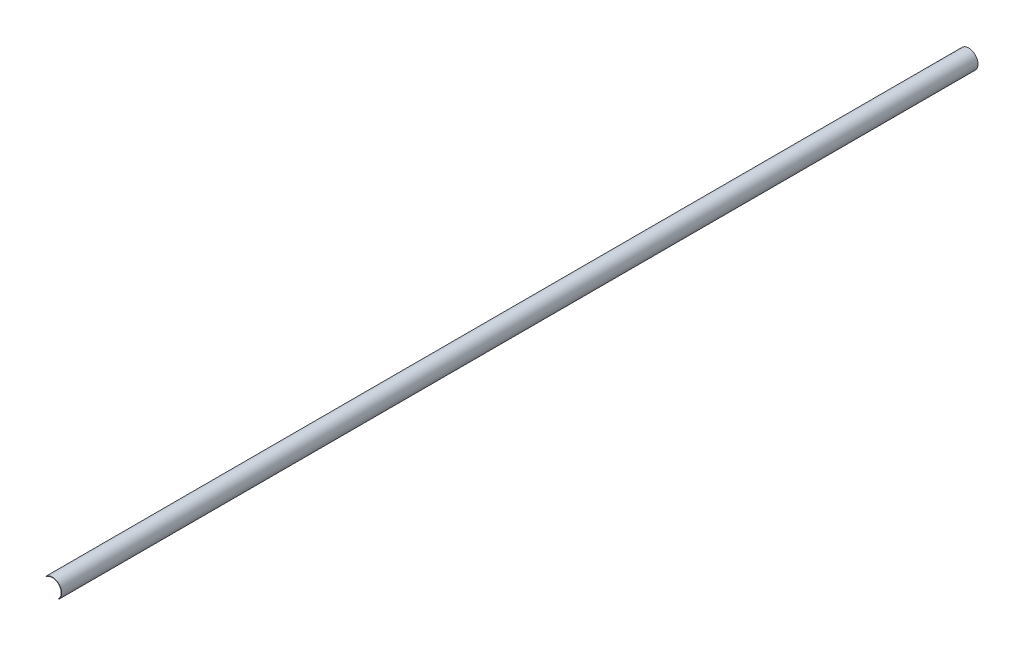
ISO-10303-21;
HEADER;
FILE_DESCRIPTION(('STEP AP214'),'2;1');
FILE_NAME('part.step','',(''),(''),'','','');
FILE_SCHEMA(('AUTOMOTIVE_DESIGN { 1 0 10303 214 1 1 1 1 }'));
ENDSEC;
DATA;
#1=APPLICATION_CONTEXT('core data for automotive mechanical design processes');
#2=APPLICATION_PROTOCOL_DEFINITION('international standard','automotive_design',2000,#1);
#3=PRODUCT_CONTEXT('',#1,'mechanical');
#4=PRODUCT('Part','Part','',(#3));
#5=PRODUCT_RELATED_PRODUCT_CATEGORY('part','',(#4));
#6=PRODUCT_DEFINITION_FORMATION('','',#4);
#7=PRODUCT_DEFINITION_CONTEXT('part definition',#1,'design');
#8=PRODUCT_DEFINITION('design','',#6,#7);
#9=PRODUCT_DEFINITION_SHAPE('','',#8);
#10=(LENGTH_UNIT() NAMED_UNIT(*) SI_UNIT(.MILLI.,.METRE.));
#11=(NAMED_UNIT(*) PLANE_ANGLE_UNIT() SI_UNIT($,.RADIAN.));
#12=(NAMED_UNIT(*) SI_UNIT($,.STERADIAN.) SOLID_ANGLE_UNIT());
#13=UNCERTAINTY_MEASURE_WITH_UNIT(LENGTH_MEASURE(1.E-05),#10,'distance_accuracy_value','');
#14=(GEOMETRIC_REPRESENTATION_CONTEXT(3) GLOBAL_UNCERTAINTY_ASSIGNED_CONTEXT((#13)) GLOBAL_UNIT_ASSIGNED_CONTEXT((#10,
#11,#12)) REPRESENTATION_CONTEXT('',''));
#15=CARTESIAN_POINT('',(0.,0.,0.));
#16=DIRECTION('',(0.,0.,1.));
#17=DIRECTION('',(1.,0.,0.));
#18=AXIS2_PLACEMENT_3D('',#15,#16,#17);
#19=CARTESIAN_POINT('',(0.,0.,2100.));
#20=DIRECTION('',(0.,0.,-1.));
#21=DIRECTION('',(-1.,0.,0.));
#22=AXIS2_PLACEMENT_3D('',#19,#20,#21);
#23=CYLINDRICAL_SURFACE('',#22,20.4);
#24=CARTESIAN_POINT('',(0.,0.,0.));
#25=DIRECTION('',(0.,0.,-1.));
#26=DIRECTION('',(-1.,0.,0.));
#27=AXIS2_PLACEMENT_3D('',#24,#25,#26);
#28=CIRCLE('',#27,20.4);
#29=CARTESIAN_POINT('',(-13.7280278540027,15.0897730678671,0.));
#30=VERTEX_POINT('',#29);
#31=CARTESIAN_POINT('',(14.2462905957764,-14.6014795230035,0.));
#32=VERTEX_POINT('',#31);
#33=EDGE_CURVE('E100',#30,#32,#28,.T.);
#34=ORIENTED_EDGE('',*,*,#33,.T.);
#35=DIRECTION('',(0.,0.,-1.));
#36=VECTOR('',#35,1.);
#37=CARTESIAN_POINT('',(14.2462905957764,-14.6014795230035,2100.));
#38=LINE('',#37,#36);
#39=CARTESIAN_POINT('',(14.2462905957764,-14.6014795230035,2100.));
#40=VERTEX_POINT('',#39);
#41=EDGE_CURVE('E11',#40,#32,#38,.T.);
#42=ORIENTED_EDGE('',*,*,#41,.F.);
#43=CARTESIAN_POINT('',(0.,0.,2100.));
#44=DIRECTION('',(0.,0.,-1.));
#45=DIRECTION('',(-1.,0.,0.));
#46=AXIS2_PLACEMENT_3D('',#43,#44,#45);
#47=CIRCLE('',#46,20.4);
#48=CARTESIAN_POINT('',(-13.7280278540027,15.0897730678671,2100.));
#49=VERTEX_POINT('',#48);
#50=EDGE_CURVE('E88',#49,#40,#47,.T.);
#51=ORIENTED_EDGE('',*,*,#50,.F.);
#52=DIRECTION('',(0.,0.,-1.));
#53=VECTOR('',#52,1.);
#54=CARTESIAN_POINT('',(-13.7280278540027,15.0897730678671,2100.));
#55=LINE('',#54,#53);
#56=EDGE_CURVE('E96',#49,#30,#55,.T.);
#57=ORIENTED_EDGE('',*,*,#56,.T.);
#58=EDGE_LOOP('',(#34,#42,#51,#57));
#59=FACE_BOUND('',#58,.T.);
#60=ADVANCED_FACE('F37',(#59),#23,.F.);
#61=CARTESIAN_POINT('',(14.9446381740008,-15.3172383231508,2100.));
#62=DIRECTION('',(0.715758800147234,0.698347578224334,0.));
#63=DIRECTION('',(-0.698347578224334,0.715758800147234,0.));
#64=AXIS2_PLACEMENT_3D('',#61,#62,#63);
#65=PLANE('',#64);
#66=DIRECTION('',(0.698347578224334,-0.715758800147234,0.));
#67=VECTOR('',#66,1.);
#68=CARTESIAN_POINT('',(14.9446381740008,-15.3172383231508,0.));
#69=LINE('',#68,#67);
#70=CARTESIAN_POINT('',(14.9446381740008,-15.3172383231508,0.));
#71=VERTEX_POINT('',#70);
#72=EDGE_CURVE('E92',#32,#71,#69,.T.);
#73=ORIENTED_EDGE('',*,*,#72,.T.);
#74=DIRECTION('',(0.,0.,-1.));
#75=VECTOR('',#74,1.);
#76=CARTESIAN_POINT('',(14.9446381740008,-15.3172383231508,2100.));
#77=LINE('',#76,#75);
#78=CARTESIAN_POINT('',(14.9446381740008,-15.3172383231508,2100.));
#79=VERTEX_POINT('',#78);
#80=EDGE_CURVE('E45',#79,#71,#77,.T.);
#81=ORIENTED_EDGE('',*,*,#80,.F.);
#82=DIRECTION('',(0.698347578224334,-0.715758800147234,0.));
#83=VECTOR('',#82,1.);
#84=CARTESIAN_POINT('',(14.9446381740008,-15.3172383231508,2100.));
#85=LINE('',#84,#83);
#86=EDGE_CURVE('E83',#40,#79,#85,.T.);
#87=ORIENTED_EDGE('',*,*,#86,.F.);
#88=ORIENTED_EDGE('',*,*,#41,.T.);
#89=EDGE_LOOP('',(#73,#81,#87,#88));
#90=FACE_BOUND('',#89,.T.);
#91=ADVANCED_FACE('F91',(#90),#65,.F.);
#92=CARTESIAN_POINT('',(0.,0.,2100.));
#93=DIRECTION('',(0.,0.,-1.));
#94=DIRECTION('',(-1.,0.,0.));
#95=AXIS2_PLACEMENT_3D('',#92,#93,#94);
#96=CYLINDRICAL_SURFACE('',#95,21.4);
#97=CARTESIAN_POINT('',(0.,0.,0.));
#98=DIRECTION('',(0.,0.,1.));
#99=DIRECTION('',(-1.,0.,0.));
#100=AXIS2_PLACEMENT_3D('',#97,#98,#99);
#101=CIRCLE('',#100,21.4);
#102=CARTESIAN_POINT('',(-14.4009703958656,15.8294678260958,0.));
#103=VERTEX_POINT('',#102);
#104=EDGE_CURVE('E70',#71,#103,#101,.T.);
#105=ORIENTED_EDGE('',*,*,#104,.T.);
#106=DIRECTION('',(0.,0.,-1.));
#107=VECTOR('',#106,1.);
#108=CARTESIAN_POINT('',(-14.4009703958656,15.8294678260958,2100.));
#109=LINE('',#108,#107);
#110=CARTESIAN_POINT('',(-14.4009703958656,15.8294678260958,2100.));
#111=VERTEX_POINT('',#110);
#112=EDGE_CURVE('E93',#111,#103,#109,.T.);
#113=ORIENTED_EDGE('',*,*,#112,.F.);
#114=CARTESIAN_POINT('',(0.,0.,2100.));
#115=DIRECTION('',(0.,0.,1.));
#116=DIRECTION('',(-1.,0.,0.));
#117=AXIS2_PLACEMENT_3D('',#114,#115,#116);
#118=CIRCLE('',#117,21.4);
#119=EDGE_CURVE('E86',#79,#111,#118,.T.);
#120=ORIENTED_EDGE('',*,*,#119,.F.);
#121=ORIENTED_EDGE('',*,*,#80,.T.);
#122=EDGE_LOOP('',(#105,#113,#120,#121));
#123=FACE_BOUND('',#122,.T.);
#124=ADVANCED_FACE('F94',(#123),#96,.T.);
#125=CARTESIAN_POINT('',(-13.7280278540027,15.0897730678671,2100.));
#126=DIRECTION('',(0.739694758228778,0.672942541862877,0.));
#127=DIRECTION('',(-0.672942541862877,0.739694758228778,0.));
#128=AXIS2_PLACEMENT_3D('',#125,#126,#127);
#129=PLANE('',#128);
#130=DIRECTION('',(0.672942541862877,-0.739694758228778,0.));
#131=VECTOR('',#130,1.);
#132=CARTESIAN_POINT('',(-13.7280278540027,15.0897730678671,0.));
#133=LINE('',#132,#131);
#134=EDGE_CURVE('E76',#103,#30,#133,.T.);
#135=ORIENTED_EDGE('',*,*,#134,.T.);
#136=ORIENTED_EDGE('',*,*,#56,.F.);
#137=DIRECTION('',(0.672942541862877,-0.739694758228778,0.));
#138=VECTOR('',#137,1.);
#139=CARTESIAN_POINT('',(-13.7280278540027,15.0897730678671,2100.));
#140=LINE('',#139,#138);
#141=EDGE_CURVE('E53',#111,#49,#140,.T.);
#142=ORIENTED_EDGE('',*,*,#141,.F.);
#143=ORIENTED_EDGE('',*,*,#112,.T.);
#144=EDGE_LOOP('',(#135,#136,#142,#143));
#145=FACE_BOUND('',#144,.T.);
#146=ADVANCED_FACE('F107',(#145),#129,.F.);
#147=CARTESIAN_POINT('',(0.,0.,2100.));
#148=DIRECTION('',(0.,0.,-1.));
#149=DIRECTION('',(-1.,0.,0.));
#150=AXIS2_PLACEMENT_3D('',#147,#148,#149);
#151=PLANE('',#150);
#152=ORIENTED_EDGE('',*,*,#50,.T.);
#153=ORIENTED_EDGE('',*,*,#86,.T.);
#154=ORIENTED_EDGE('',*,*,#119,.T.);
#155=ORIENTED_EDGE('',*,*,#141,.T.);
#156=EDGE_LOOP('',(#152,#153,#154,#155));
#157=FACE_BOUND('',#156,.T.);
#158=ADVANCED_FACE('F84',(#157),#151,.F.);
#159=CARTESIAN_POINT('',(0.,0.,0.));
#160=DIRECTION('',(0.,0.,-1.));
#161=DIRECTION('',(-1.,0.,0.));
#162=AXIS2_PLACEMENT_3D('',#159,#160,#161);
#163=PLANE('',#162);
#164=ORIENTED_EDGE('',*,*,#33,.F.);
#165=ORIENTED_EDGE('',*,*,#134,.F.);
#166=ORIENTED_EDGE('',*,*,#104,.F.);
#167=ORIENTED_EDGE('',*,*,#72,.F.);
#168=EDGE_LOOP('',(#164,#165,#166,#167));
#169=FACE_BOUND('',#168,.T.);
#170=ADVANCED_FACE('F110',(#169),#163,.T.);
#171=CLOSED_SHELL('',(#60,#91,#124,#146,#158,#170));
#172=MANIFOLD_SOLID_BREP('B2',#171);
#173=ADVANCED_BREP_SHAPE_REPRESENTATION('',(#18,#172),#14);
#174=SHAPE_DEFINITION_REPRESENTATION(#9,#173);
ENDSEC;
END-ISO-10303-21;
